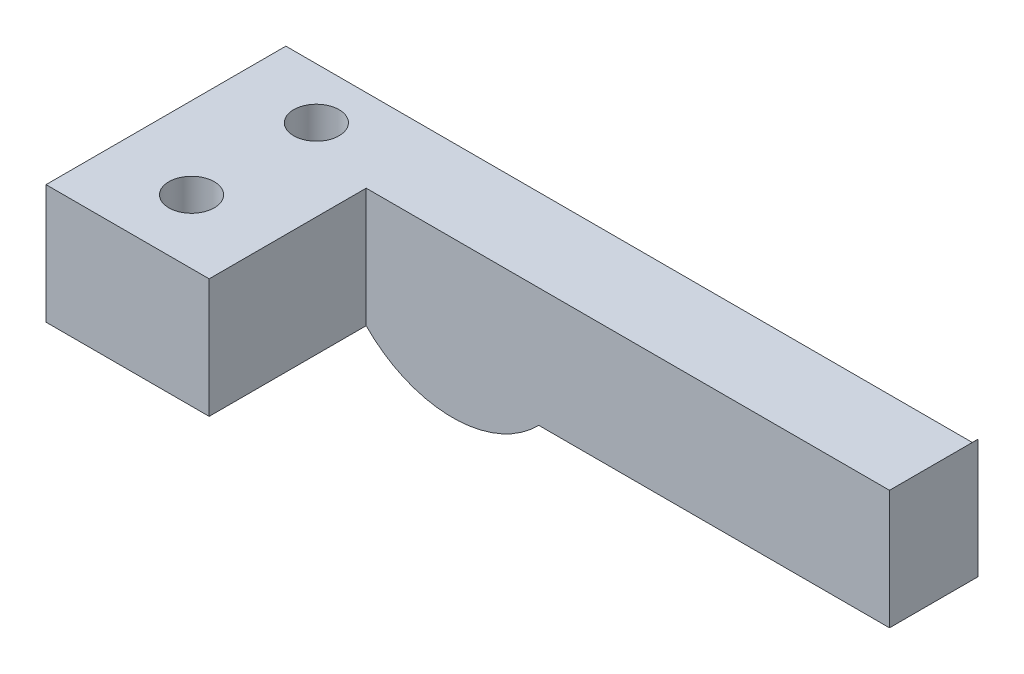
ISO-10303-21;
HEADER;
FILE_DESCRIPTION(('STEP AP214'),'2;1');
FILE_NAME('part.step','',(''),(''),'','','');
FILE_SCHEMA(('AUTOMOTIVE_DESIGN { 1 0 10303 214 1 1 1 1 }'));
ENDSEC;
DATA;
#1=APPLICATION_CONTEXT('core data for automotive mechanical design processes');
#2=APPLICATION_PROTOCOL_DEFINITION('international standard','automotive_design',2000,#1);
#3=PRODUCT_CONTEXT('',#1,'mechanical');
#4=PRODUCT('Part','Part','',(#3));
#5=PRODUCT_RELATED_PRODUCT_CATEGORY('part','',(#4));
#6=PRODUCT_DEFINITION_FORMATION('','',#4);
#7=PRODUCT_DEFINITION_CONTEXT('part definition',#1,'design');
#8=PRODUCT_DEFINITION('design','',#6,#7);
#9=PRODUCT_DEFINITION_SHAPE('','',#8);
#10=(LENGTH_UNIT() NAMED_UNIT(*) SI_UNIT(.MILLI.,.METRE.));
#11=(NAMED_UNIT(*) PLANE_ANGLE_UNIT() SI_UNIT($,.RADIAN.));
#12=(NAMED_UNIT(*) SI_UNIT($,.STERADIAN.) SOLID_ANGLE_UNIT());
#13=UNCERTAINTY_MEASURE_WITH_UNIT(LENGTH_MEASURE(1.E-05),#10,'distance_accuracy_value','');
#14=(GEOMETRIC_REPRESENTATION_CONTEXT(3) GLOBAL_UNCERTAINTY_ASSIGNED_CONTEXT((#13)) GLOBAL_UNIT_ASSIGNED_CONTEXT((#10,
#11,#12)) REPRESENTATION_CONTEXT('',''));
#15=CARTESIAN_POINT('',(0.,0.,0.));
#16=DIRECTION('',(0.,0.,1.));
#17=DIRECTION('',(1.,0.,0.));
#18=AXIS2_PLACEMENT_3D('',#15,#16,#17);
#19=CARTESIAN_POINT('',(0.,0.,10.82));
#20=DIRECTION('',(0.,1.,0.));
#21=DIRECTION('',(0.,0.,1.));
#22=AXIS2_PLACEMENT_3D('',#19,#20,#21);
#23=PLANE('',#22);
#24=DIRECTION('',(0.0245905017222381,0.,-0.999697607892031));
#25=VECTOR('',#24,1.);
#26=CARTESIAN_POINT('',(31.4938523745694,0.,0.249924401973008));
#27=LINE('',#26,#25);
#28=CARTESIAN_POINT('',(31.4938523745694,0.,0.249924401973008));
#29=VERTEX_POINT('',#28);
#30=CARTESIAN_POINT('',(31.5,0.,0.));
#31=VERTEX_POINT('',#30);
#32=EDGE_CURVE('E117',#29,#31,#27,.T.);
#33=ORIENTED_EDGE('',*,*,#32,.F.);
#34=DIRECTION('',(1.,0.,0.));
#35=VECTOR('',#34,1.);
#36=CARTESIAN_POINT('',(1.25,0.,0.249924401973008));
#37=LINE('',#36,#35);
#38=CARTESIAN_POINT('',(1.25,0.,0.249924401973008));
#39=VERTEX_POINT('',#38);
#40=EDGE_CURVE('E109',#39,#29,#37,.T.);
#41=ORIENTED_EDGE('',*,*,#40,.F.);
#42=DIRECTION('',(0.,0.,-1.));
#43=VECTOR('',#42,1.);
#44=CARTESIAN_POINT('',(1.25,0.,10.82));
#45=LINE('',#44,#43);
#46=CARTESIAN_POINT('',(1.25,0.,10.82));
#47=VERTEX_POINT('',#46);
#48=EDGE_CURVE('E42',#47,#39,#45,.T.);
#49=ORIENTED_EDGE('',*,*,#48,.F.);
#50=DIRECTION('',(1.,0.,0.));
#51=VECTOR('',#50,1.);
#52=CARTESIAN_POINT('',(0.,0.,10.82));
#53=LINE('',#52,#51);
#54=CARTESIAN_POINT('',(8.44,0.,10.82));
#55=VERTEX_POINT('',#54);
#56=EDGE_CURVE('E142',#47,#55,#53,.T.);
#57=ORIENTED_EDGE('',*,*,#56,.T.);
#58=DIRECTION('',(0.,0.,-1.));
#59=VECTOR('',#58,1.);
#60=CARTESIAN_POINT('',(8.44,0.,10.82));
#61=LINE('',#60,#59);
#62=CARTESIAN_POINT('',(8.44,0.,3.9));
#63=VERTEX_POINT('',#62);
#64=EDGE_CURVE('E134',#55,#63,#61,.T.);
#65=ORIENTED_EDGE('',*,*,#64,.T.);
#66=DIRECTION('',(1.,0.,0.));
#67=VECTOR('',#66,1.);
#68=CARTESIAN_POINT('',(0.,0.,3.9));
#69=LINE('',#68,#67);
#70=CARTESIAN_POINT('',(31.5,0.,3.9));
#71=VERTEX_POINT('',#70);
#72=EDGE_CURVE('E49',#63,#71,#69,.T.);
#73=ORIENTED_EDGE('',*,*,#72,.T.);
#74=DIRECTION('',(0.,0.,-1.));
#75=VECTOR('',#74,1.);
#76=CARTESIAN_POINT('',(31.5,0.,3.9));
#77=LINE('',#76,#75);
#78=EDGE_CURVE('E153',#71,#31,#77,.T.);
#79=ORIENTED_EDGE('',*,*,#78,.T.);
#80=EDGE_LOOP('',(#33,#41,#49,#57,#65,#73,#79));
#81=FACE_BOUND('',#80,.T.);
#82=CARTESIAN_POINT('',(4.845,0.,8.));
#83=DIRECTION('',(0.,1.,0.));
#84=DIRECTION('',(0.,0.,1.));
#85=AXIS2_PLACEMENT_3D('',#82,#83,#84);
#86=CIRCLE('',#85,1.);
#87=CARTESIAN_POINT('',(4.845,0.,9.));
#88=VERTEX_POINT('',#87);
#89=EDGE_CURVE('E177',#88,#88,#86,.T.);
#90=ORIENTED_EDGE('',*,*,#89,.F.);
#91=EDGE_LOOP('',(#90));
#92=FACE_BOUND('',#91,.T.);
#93=CARTESIAN_POINT('',(4.845,0.,2.5));
#94=DIRECTION('',(0.,1.,0.));
#95=DIRECTION('',(0.,0.,1.));
#96=AXIS2_PLACEMENT_3D('',#93,#94,#95);
#97=CIRCLE('',#96,1.);
#98=CARTESIAN_POINT('',(4.845,0.,3.5));
#99=VERTEX_POINT('',#98);
#100=EDGE_CURVE('E171',#99,#99,#97,.T.);
#101=ORIENTED_EDGE('',*,*,#100,.F.);
#102=EDGE_LOOP('',(#101));
#103=FACE_BOUND('',#102,.T.);
#104=ADVANCED_FACE('F35',(#81,#92,#103),#23,.T.);
#105=CARTESIAN_POINT('',(1.25,0.,10.82));
#106=DIRECTION('',(-1.,0.,0.));
#107=DIRECTION('',(0.,0.,1.));
#108=AXIS2_PLACEMENT_3D('',#105,#106,#107);
#109=PLANE('',#108);
#110=DIRECTION('',(0.,1.,0.));
#111=VECTOR('',#110,1.);
#112=CARTESIAN_POINT('',(1.25,-10.,0.249924401973008));
#113=LINE('',#112,#111);
#114=CARTESIAN_POINT('',(1.25,-5.25,0.249924401973008));
#115=VERTEX_POINT('',#114);
#116=EDGE_CURVE('E105',#115,#39,#113,.T.);
#117=ORIENTED_EDGE('',*,*,#116,.F.);
#118=DIRECTION('',(0.,0.,-1.));
#119=VECTOR('',#118,1.);
#120=CARTESIAN_POINT('',(1.25,-5.25,10.82));
#121=LINE('',#120,#119);
#122=CARTESIAN_POINT('',(1.25,-5.25,10.82));
#123=VERTEX_POINT('',#122);
#124=EDGE_CURVE('E128',#123,#115,#121,.T.);
#125=ORIENTED_EDGE('',*,*,#124,.F.);
#126=DIRECTION('',(0.,1.,0.));
#127=VECTOR('',#126,1.);
#128=CARTESIAN_POINT('',(1.25,0.,10.82));
#129=LINE('',#128,#127);
#130=EDGE_CURVE('E127',#123,#47,#129,.T.);
#131=ORIENTED_EDGE('',*,*,#130,.T.);
#132=ORIENTED_EDGE('',*,*,#48,.T.);
#133=EDGE_LOOP('',(#117,#125,#131,#132));
#134=FACE_BOUND('',#133,.T.);
#135=ADVANCED_FACE('F125',(#134),#109,.T.);
#136=CARTESIAN_POINT('',(0.,-5.25,10.82));
#137=DIRECTION('',(0.,-1.,0.));
#138=DIRECTION('',(0.,0.,-1.));
#139=AXIS2_PLACEMENT_3D('',#136,#137,#138);
#140=PLANE('',#139);
#141=DIRECTION('',(-1.,0.,0.));
#142=VECTOR('',#141,1.);
#143=CARTESIAN_POINT('',(0.,-5.25,0.249924401973007));
#144=LINE('',#143,#142);
#145=CARTESIAN_POINT('',(8.44,-5.25,0.249924401973008));
#146=VERTEX_POINT('',#145);
#147=EDGE_CURVE('E112',#146,#115,#144,.T.);
#148=ORIENTED_EDGE('',*,*,#147,.F.);
#149=DIRECTION('',(0.,0.,-1.));
#150=VECTOR('',#149,1.);
#151=CARTESIAN_POINT('',(8.44,-5.25,3.9));
#152=LINE('',#151,#150);
#153=CARTESIAN_POINT('',(8.44,-5.25,3.9));
#154=VERTEX_POINT('',#153);
#155=EDGE_CURVE('E144',#154,#146,#152,.T.);
#156=ORIENTED_EDGE('',*,*,#155,.F.);
#157=DIRECTION('',(0.,0.,-1.));
#158=VECTOR('',#157,1.);
#159=CARTESIAN_POINT('',(8.44,-5.25,10.82));
#160=LINE('',#159,#158);
#161=CARTESIAN_POINT('',(8.44,-5.25,10.82));
#162=VERTEX_POINT('',#161);
#163=EDGE_CURVE('E129',#162,#154,#160,.T.);
#164=ORIENTED_EDGE('',*,*,#163,.F.);
#165=DIRECTION('',(-1.,0.,0.));
#166=VECTOR('',#165,1.);
#167=CARTESIAN_POINT('',(0.,-5.25,10.82));
#168=LINE('',#167,#166);
#169=EDGE_CURVE('E138',#162,#123,#168,.T.);
#170=ORIENTED_EDGE('',*,*,#169,.T.);
#171=ORIENTED_EDGE('',*,*,#124,.T.);
#172=EDGE_LOOP('',(#148,#156,#164,#170,#171));
#173=FACE_BOUND('',#172,.T.);
#174=CARTESIAN_POINT('',(4.845,-5.25,8.));
#175=DIRECTION('',(0.,-1.,0.));
#176=DIRECTION('',(0.,0.,-1.));
#177=AXIS2_PLACEMENT_3D('',#174,#175,#176);
#178=CIRCLE('',#177,1.);
#179=CARTESIAN_POINT('',(4.845,-5.25,7.));
#180=VERTEX_POINT('',#179);
#181=EDGE_CURVE('E174',#180,#180,#178,.F.);
#182=ORIENTED_EDGE('',*,*,#181,.T.);
#183=EDGE_LOOP('',(#182));
#184=FACE_BOUND('',#183,.T.);
#185=CARTESIAN_POINT('',(4.845,-5.25,2.5));
#186=DIRECTION('',(0.,-1.,0.));
#187=DIRECTION('',(0.,0.,-1.));
#188=AXIS2_PLACEMENT_3D('',#185,#186,#187);
#189=CIRCLE('',#188,1.);
#190=CARTESIAN_POINT('',(4.845,-5.25,1.5));
#191=VERTEX_POINT('',#190);
#192=EDGE_CURVE('E158',#191,#191,#189,.F.);
#193=ORIENTED_EDGE('',*,*,#192,.T.);
#194=EDGE_LOOP('',(#193));
#195=FACE_BOUND('',#194,.T.);
#196=ADVANCED_FACE('F203',(#173,#184,#195),#140,.T.);
#197=CARTESIAN_POINT('',(8.44,0.,10.82));
#198=DIRECTION('',(-1.,0.,0.));
#199=DIRECTION('',(0.,0.,1.));
#200=AXIS2_PLACEMENT_3D('',#197,#198,#199);
#201=PLANE('',#200);
#202=ORIENTED_EDGE('',*,*,#163,.T.);
#203=DIRECTION('',(0.,1.,0.));
#204=VECTOR('',#203,1.);
#205=CARTESIAN_POINT('',(8.44,0.,3.9));
#206=LINE('',#205,#204);
#207=EDGE_CURVE('E157',#154,#63,#206,.T.);
#208=ORIENTED_EDGE('',*,*,#207,.T.);
#209=ORIENTED_EDGE('',*,*,#64,.F.);
#210=DIRECTION('',(0.,1.,0.));
#211=VECTOR('',#210,1.);
#212=CARTESIAN_POINT('',(8.44,0.,10.82));
#213=LINE('',#212,#211);
#214=EDGE_CURVE('E57',#162,#55,#213,.T.);
#215=ORIENTED_EDGE('',*,*,#214,.F.);
#216=EDGE_LOOP('',(#202,#208,#209,#215));
#217=FACE_BOUND('',#216,.T.);
#218=ADVANCED_FACE('F207',(#217),#201,.F.);
#219=CARTESIAN_POINT('',(0.,0.,10.82));
#220=DIRECTION('',(0.,0.,1.));
#221=DIRECTION('',(1.,0.,0.));
#222=AXIS2_PLACEMENT_3D('',#219,#220,#221);
#223=PLANE('',#222);
#224=ORIENTED_EDGE('',*,*,#56,.F.);
#225=ORIENTED_EDGE('',*,*,#130,.F.);
#226=ORIENTED_EDGE('',*,*,#169,.F.);
#227=ORIENTED_EDGE('',*,*,#214,.T.);
#228=EDGE_LOOP('',(#224,#225,#226,#227));
#229=FACE_BOUND('',#228,.T.);
#230=ADVANCED_FACE('F205',(#229),#223,.T.);
#231=CARTESIAN_POINT('',(12.24,-1.55540935961777,3.9));
#232=DIRECTION('',(0.,0.,-1.));
#233=DIRECTION('',(-1.,0.,0.));
#234=AXIS2_PLACEMENT_3D('',#231,#232,#233);
#235=CYLINDRICAL_SURFACE('',#234,5.3);
#236=ORIENTED_EDGE('',*,*,#155,.T.);
#237=CARTESIAN_POINT('',(12.24,-1.55540935961777,0.249924401973008));
#238=DIRECTION('',(0.,0.,1.));
#239=DIRECTION('',(1.,0.,0.));
#240=AXIS2_PLACEMENT_3D('',#237,#238,#239);
#241=CIRCLE('',#240,5.3);
#242=CARTESIAN_POINT('',(16.04,-5.25,0.249924401973008));
#243=VERTEX_POINT('',#242);
#244=EDGE_CURVE('E181',#146,#243,#241,.T.);
#245=ORIENTED_EDGE('',*,*,#244,.T.);
#246=DIRECTION('',(0.,0.,-1.));
#247=VECTOR('',#246,1.);
#248=CARTESIAN_POINT('',(16.04,-5.25,3.9));
#249=LINE('',#248,#247);
#250=CARTESIAN_POINT('',(16.04,-5.25,3.9));
#251=VERTEX_POINT('',#250);
#252=EDGE_CURVE('E147',#251,#243,#249,.T.);
#253=ORIENTED_EDGE('',*,*,#252,.F.);
#254=CARTESIAN_POINT('',(12.24,-1.55540935961777,3.9));
#255=DIRECTION('',(0.,0.,1.));
#256=DIRECTION('',(1.,0.,0.));
#257=AXIS2_PLACEMENT_3D('',#254,#255,#256);
#258=CIRCLE('',#257,5.3);
#259=EDGE_CURVE('E166',#154,#251,#258,.T.);
#260=ORIENTED_EDGE('',*,*,#259,.F.);
#261=EDGE_LOOP('',(#236,#245,#253,#260));
#262=FACE_BOUND('',#261,.T.);
#263=ADVANCED_FACE('F201',(#262),#235,.T.);
#264=CARTESIAN_POINT('',(0.,-5.25,3.9));
#265=DIRECTION('',(0.,-1.,0.));
#266=DIRECTION('',(1.,0.,0.));
#267=AXIS2_PLACEMENT_3D('',#264,#265,#266);
#268=PLANE('',#267);
#269=DIRECTION('',(-0.0245905017222381,0.,0.999697607892031));
#270=VECTOR('',#269,1.);
#271=CARTESIAN_POINT('',(31.3850782211695,-5.25,4.67200826925816));
#272=LINE('',#271,#270);
#273=CARTESIAN_POINT('',(31.5,-5.25,0.));
#274=VERTEX_POINT('',#273);
#275=CARTESIAN_POINT('',(31.4938523745694,-5.25,0.249924401973008));
#276=VERTEX_POINT('',#275);
#277=EDGE_CURVE('E184',#274,#276,#272,.T.);
#278=ORIENTED_EDGE('',*,*,#277,.F.);
#279=DIRECTION('',(0.,0.,-1.));
#280=VECTOR('',#279,1.);
#281=CARTESIAN_POINT('',(31.5,-5.25,3.9));
#282=LINE('',#281,#280);
#283=CARTESIAN_POINT('',(31.5,-5.25,3.9));
#284=VERTEX_POINT('',#283);
#285=EDGE_CURVE('E150',#284,#274,#282,.T.);
#286=ORIENTED_EDGE('',*,*,#285,.F.);
#287=DIRECTION('',(-1.,0.,0.));
#288=VECTOR('',#287,1.);
#289=CARTESIAN_POINT('',(0.,-5.25,3.9));
#290=LINE('',#289,#288);
#291=EDGE_CURVE('E163',#284,#251,#290,.T.);
#292=ORIENTED_EDGE('',*,*,#291,.T.);
#293=ORIENTED_EDGE('',*,*,#252,.T.);
#294=DIRECTION('',(-1.,0.,0.));
#295=VECTOR('',#294,1.);
#296=CARTESIAN_POINT('',(0.,-5.25,0.249924401973008));
#297=LINE('',#296,#295);
#298=EDGE_CURVE('E11',#276,#243,#297,.T.);
#299=ORIENTED_EDGE('',*,*,#298,.F.);
#300=EDGE_LOOP('',(#278,#286,#292,#293,#299));
#301=FACE_BOUND('',#300,.T.);
#302=ADVANCED_FACE('F195',(#301),#268,.T.);
#303=CARTESIAN_POINT('',(31.5,0.,3.9));
#304=DIRECTION('',(1.,0.,0.));
#305=DIRECTION('',(0.,0.,-1.));
#306=AXIS2_PLACEMENT_3D('',#303,#304,#305);
#307=PLANE('',#306);
#308=DIRECTION('',(0.,-1.,0.));
#309=VECTOR('',#308,1.);
#310=CARTESIAN_POINT('',(31.5,0.,0.));
#311=LINE('',#310,#309);
#312=EDGE_CURVE('E155',#31,#274,#311,.T.);
#313=ORIENTED_EDGE('',*,*,#312,.F.);
#314=ORIENTED_EDGE('',*,*,#78,.F.);
#315=DIRECTION('',(0.,-1.,0.));
#316=VECTOR('',#315,1.);
#317=CARTESIAN_POINT('',(31.5,0.,3.9));
#318=LINE('',#317,#316);
#319=EDGE_CURVE('E160',#71,#284,#318,.T.);
#320=ORIENTED_EDGE('',*,*,#319,.T.);
#321=ORIENTED_EDGE('',*,*,#285,.T.);
#322=EDGE_LOOP('',(#313,#314,#320,#321));
#323=FACE_BOUND('',#322,.T.);
#324=ADVANCED_FACE('F192',(#323),#307,.T.);
#325=CARTESIAN_POINT('',(0.,0.,3.9));
#326=DIRECTION('',(0.,0.,1.));
#327=DIRECTION('',(1.,0.,0.));
#328=AXIS2_PLACEMENT_3D('',#325,#326,#327);
#329=PLANE('',#328);
#330=ORIENTED_EDGE('',*,*,#207,.F.);
#331=ORIENTED_EDGE('',*,*,#259,.T.);
#332=ORIENTED_EDGE('',*,*,#291,.F.);
#333=ORIENTED_EDGE('',*,*,#319,.F.);
#334=ORIENTED_EDGE('',*,*,#72,.F.);
#335=EDGE_LOOP('',(#330,#331,#332,#333,#334));
#336=FACE_BOUND('',#335,.T.);
#337=ADVANCED_FACE('F197',(#336),#329,.T.);
#338=CARTESIAN_POINT('',(4.845,-8.07842712474619,2.5));
#339=DIRECTION('',(0.,1.,0.));
#340=DIRECTION('',(0.,0.,1.));
#341=AXIS2_PLACEMENT_3D('',#338,#339,#340);
#342=CYLINDRICAL_SURFACE('',#341,1.);
#343=ORIENTED_EDGE('',*,*,#100,.T.);
#344=EDGE_LOOP('',(#343));
#345=FACE_BOUND('',#344,.T.);
#346=ORIENTED_EDGE('',*,*,#192,.F.);
#347=EDGE_LOOP('',(#346));
#348=FACE_BOUND('',#347,.T.);
#349=ADVANCED_FACE('F269',(#345,#348),#342,.F.);
#350=CARTESIAN_POINT('',(4.845,-8.07842712474619,8.));
#351=DIRECTION('',(0.,1.,0.));
#352=DIRECTION('',(0.,0.,1.));
#353=AXIS2_PLACEMENT_3D('',#350,#351,#352);
#354=CYLINDRICAL_SURFACE('',#353,1.);
#355=ORIENTED_EDGE('',*,*,#89,.T.);
#356=EDGE_LOOP('',(#355));
#357=FACE_BOUND('',#356,.T.);
#358=ORIENTED_EDGE('',*,*,#181,.F.);
#359=EDGE_LOOP('',(#358));
#360=FACE_BOUND('',#359,.T.);
#361=ADVANCED_FACE('F253',(#357,#360),#354,.F.);
#362=CARTESIAN_POINT('',(31.4938523745694,-10.,0.249924401973008));
#363=DIRECTION('',(0.999697607892031,0.,0.0245905017222381));
#364=DIRECTION('',(0.0245905017222381,0.,-0.999697607892031));
#365=AXIS2_PLACEMENT_3D('',#362,#363,#364);
#366=PLANE('',#365);
#367=ORIENTED_EDGE('',*,*,#277,.T.);
#368=DIRECTION('',(0.,1.,0.));
#369=VECTOR('',#368,1.);
#370=CARTESIAN_POINT('',(31.4938523745694,-10.,0.249924401973008));
#371=LINE('',#370,#369);
#372=EDGE_CURVE('E116',#276,#29,#371,.T.);
#373=ORIENTED_EDGE('',*,*,#372,.T.);
#374=ORIENTED_EDGE('',*,*,#32,.T.);
#375=ORIENTED_EDGE('',*,*,#312,.T.);
#376=EDGE_LOOP('',(#367,#373,#374,#375));
#377=FACE_BOUND('',#376,.T.);
#378=ADVANCED_FACE('F188',(#377),#366,.F.);
#379=CARTESIAN_POINT('',(1.25,-10.,0.249924401973008));
#380=DIRECTION('',(0.,0.,1.));
#381=DIRECTION('',(1.,0.,0.));
#382=AXIS2_PLACEMENT_3D('',#379,#380,#381);
#383=PLANE('',#382);
#384=ORIENTED_EDGE('',*,*,#147,.T.);
#385=ORIENTED_EDGE('',*,*,#116,.T.);
#386=ORIENTED_EDGE('',*,*,#40,.T.);
#387=ORIENTED_EDGE('',*,*,#372,.F.);
#388=ORIENTED_EDGE('',*,*,#298,.T.);
#389=ORIENTED_EDGE('',*,*,#244,.F.);
#390=EDGE_LOOP('',(#384,#385,#386,#387,#388,#389));
#391=FACE_BOUND('',#390,.T.);
#392=ADVANCED_FACE('F107',(#391),#383,.F.);
#393=CLOSED_SHELL('',(#104,#135,#196,#218,#230,#263,#302,#324,#337,#349,#361,#378,#392));
#394=MANIFOLD_SOLID_BREP('B2',#393);
#395=ADVANCED_BREP_SHAPE_REPRESENTATION('',(#18,#394),#14);
#396=SHAPE_DEFINITION_REPRESENTATION(#9,#395);
ENDSEC;
END-ISO-10303-21;
